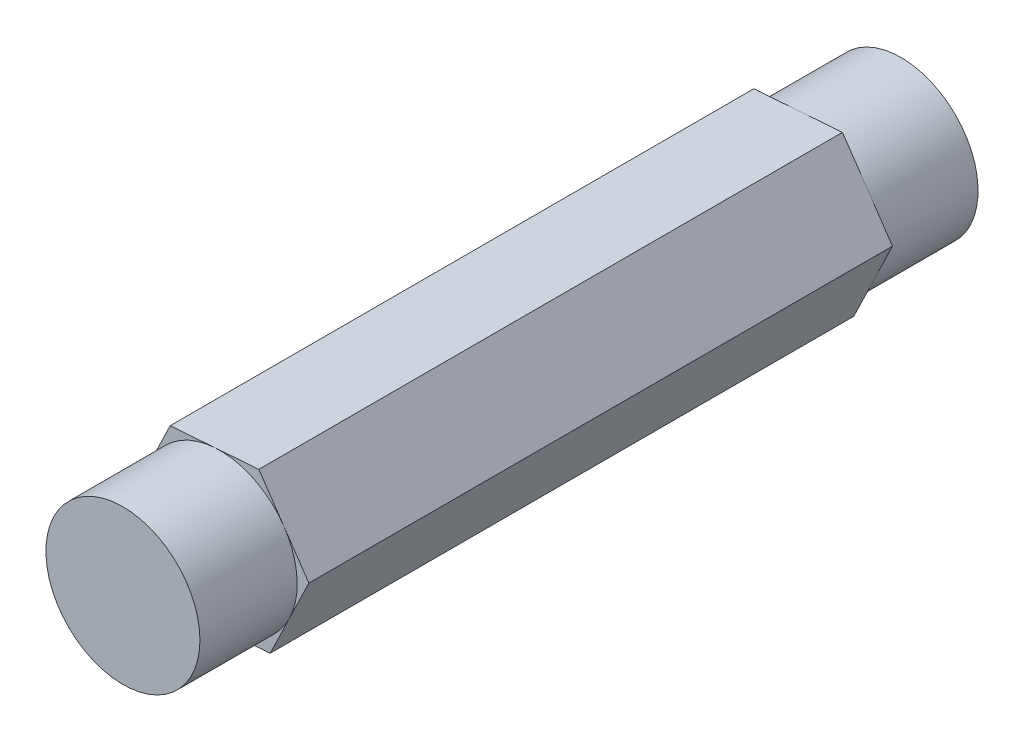
ISO-10303-21;
HEADER;
FILE_DESCRIPTION(('STEP AP214'),'2;1');
FILE_NAME('part.step','',(''),(''),'','','');
FILE_SCHEMA(('AUTOMOTIVE_DESIGN { 1 0 10303 214 1 1 1 1 }'));
ENDSEC;
DATA;
#1=APPLICATION_CONTEXT('core data for automotive mechanical design processes');
#2=APPLICATION_PROTOCOL_DEFINITION('international standard','automotive_design',2000,#1);
#3=PRODUCT_CONTEXT('',#1,'mechanical');
#4=PRODUCT('Part','Part','',(#3));
#5=PRODUCT_RELATED_PRODUCT_CATEGORY('part','',(#4));
#6=PRODUCT_DEFINITION_FORMATION('','',#4);
#7=PRODUCT_DEFINITION_CONTEXT('part definition',#1,'design');
#8=PRODUCT_DEFINITION('design','',#6,#7);
#9=PRODUCT_DEFINITION_SHAPE('','',#8);
#10=(LENGTH_UNIT() NAMED_UNIT(*) SI_UNIT(.MILLI.,.METRE.));
#11=(NAMED_UNIT(*) PLANE_ANGLE_UNIT() SI_UNIT($,.RADIAN.));
#12=(NAMED_UNIT(*) SI_UNIT($,.STERADIAN.) SOLID_ANGLE_UNIT());
#13=UNCERTAINTY_MEASURE_WITH_UNIT(LENGTH_MEASURE(1.E-05),#10,'distance_accuracy_value','');
#14=(GEOMETRIC_REPRESENTATION_CONTEXT(3) GLOBAL_UNCERTAINTY_ASSIGNED_CONTEXT((#13)) GLOBAL_UNIT_ASSIGNED_CONTEXT((#10,
#11,#12)) REPRESENTATION_CONTEXT('',''));
#15=CARTESIAN_POINT('',(0.,0.,0.));
#16=DIRECTION('',(0.,0.,1.));
#17=DIRECTION('',(1.,0.,0.));
#18=AXIS2_PLACEMENT_3D('',#15,#16,#17);
#19=CARTESIAN_POINT('',(0.,0.,36.));
#20=DIRECTION('',(0.,0.,1.));
#21=DIRECTION('',(1.,0.,0.));
#22=AXIS2_PLACEMENT_3D('',#19,#20,#21);
#23=PLANE('',#22);
#24=CARTESIAN_POINT('',(0.,0.,36.));
#25=DIRECTION('',(0.,0.,1.));
#26=DIRECTION('',(1.,0.,0.));
#27=AXIS2_PLACEMENT_3D('',#24,#25,#26);
#28=CIRCLE('',#27,4.75);
#29=CARTESIAN_POINT('',(3.92687464380982,2.67248115649176,36.));
#30=VERTEX_POINT('',#29);
#31=CARTESIAN_POINT('',(-0.35099925075217,4.73701377726215,36.));
#32=VERTEX_POINT('',#31);
#33=EDGE_CURVE('E45',#30,#32,#28,.T.);
#34=ORIENTED_EDGE('',*,*,#33,.F.);
#35=DIRECTION('',(-0.562627611893002,0.826710451328382,0.));
#36=VECTOR('',#35,1.);
#37=CARTESIAN_POINT('',(5.46983235891454,0.405299023814245,36.));
#38=LINE('',#37,#36);
#39=CARTESIAN_POINT('',(2.3839169287051,4.93966328916928,36.));
#40=VERTEX_POINT('',#39);
#41=EDGE_CURVE('E138',#30,#40,#38,.T.);
#42=ORIENTED_EDGE('',*,*,#41,.T.);
#43=DIRECTION('',(-0.997266058370979,-0.0738945791057199,0.));
#44=VECTOR('',#43,1.);
#45=CARTESIAN_POINT('',(2.3839169287051,4.93966328916928,36.));
#46=LINE('',#45,#44);
#47=EDGE_CURVE('E151',#40,#32,#46,.T.);
#48=ORIENTED_EDGE('',*,*,#47,.T.);
#49=EDGE_LOOP('',(#34,#42,#48));
#50=FACE_BOUND('',#49,.T.);
#51=ADVANCED_FACE('F34',(#50),#23,.T.);
#52=CARTESIAN_POINT('',(-4.27787389456199,2.06453262077039,36.));
#53=VERTEX_POINT('',#52);
#54=EDGE_CURVE('E11',#32,#53,#28,.T.);
#55=ORIENTED_EDGE('',*,*,#54,.F.);
#56=CARTESIAN_POINT('',(-3.08591543020944,4.53436426535503,36.));
#57=VERTEX_POINT('',#56);
#58=EDGE_CURVE('E137',#32,#57,#46,.T.);
#59=ORIENTED_EDGE('',*,*,#58,.T.);
#60=DIRECTION('',(-0.434638446477977,-0.900605030434103,0.));
#61=VECTOR('',#60,1.);
#62=CARTESIAN_POINT('',(-3.08591543020944,4.53436426535503,36.));
#63=LINE('',#62,#61);
#64=EDGE_CURVE('E171',#57,#53,#63,.T.);
#65=ORIENTED_EDGE('',*,*,#64,.T.);
#66=EDGE_LOOP('',(#55,#59,#65));
#67=FACE_BOUND('',#66,.T.);
#68=ADVANCED_FACE('F253',(#67),#23,.T.);
#69=CARTESIAN_POINT('',(-3.92687464380982,-2.67248115649176,36.));
#70=VERTEX_POINT('',#69);
#71=EDGE_CURVE('E43',#53,#70,#28,.T.);
#72=ORIENTED_EDGE('',*,*,#71,.F.);
#73=CARTESIAN_POINT('',(-5.46983235891454,-0.405299023814246,36.));
#74=VERTEX_POINT('',#73);
#75=EDGE_CURVE('E170',#53,#74,#63,.T.);
#76=ORIENTED_EDGE('',*,*,#75,.T.);
#77=DIRECTION('',(0.562627611893002,-0.826710451328382,0.));
#78=VECTOR('',#77,1.);
#79=CARTESIAN_POINT('',(-5.46983235891454,-0.405299023814246,36.));
#80=LINE('',#79,#78);
#81=EDGE_CURVE('E175',#74,#70,#80,.T.);
#82=ORIENTED_EDGE('',*,*,#81,.T.);
#83=EDGE_LOOP('',(#72,#76,#82));
#84=FACE_BOUND('',#83,.T.);
#85=ADVANCED_FACE('F256',(#84),#23,.T.);
#86=CARTESIAN_POINT('',(0.350999250752171,-4.73701377726215,36.));
#87=VERTEX_POINT('',#86);
#88=EDGE_CURVE('E60',#70,#87,#28,.T.);
#89=ORIENTED_EDGE('',*,*,#88,.F.);
#90=CARTESIAN_POINT('',(-2.3839169287051,-4.93966328916928,36.));
#91=VERTEX_POINT('',#90);
#92=EDGE_CURVE('E174',#70,#91,#80,.T.);
#93=ORIENTED_EDGE('',*,*,#92,.T.);
#94=DIRECTION('',(0.997266058370979,0.0738945791057201,0.));
#95=VECTOR('',#94,1.);
#96=CARTESIAN_POINT('',(-2.3839169287051,-4.93966328916928,36.));
#97=LINE('',#96,#95);
#98=EDGE_CURVE('E179',#91,#87,#97,.T.);
#99=ORIENTED_EDGE('',*,*,#98,.T.);
#100=EDGE_LOOP('',(#89,#93,#99));
#101=FACE_BOUND('',#100,.T.);
#102=ADVANCED_FACE('F258',(#101),#23,.T.);
#103=CARTESIAN_POINT('',(4.27787389456199,-2.06453262077039,36.));
#104=VERTEX_POINT('',#103);
#105=EDGE_CURVE('E52',#87,#104,#28,.T.);
#106=ORIENTED_EDGE('',*,*,#105,.F.);
#107=CARTESIAN_POINT('',(3.08591543020944,-4.53436426535503,36.));
#108=VERTEX_POINT('',#107);
#109=EDGE_CURVE('E178',#87,#108,#97,.T.);
#110=ORIENTED_EDGE('',*,*,#109,.T.);
#111=DIRECTION('',(0.434638446477977,0.900605030434103,0.));
#112=VECTOR('',#111,1.);
#113=CARTESIAN_POINT('',(3.08591543020944,-4.53436426535503,36.));
#114=LINE('',#113,#112);
#115=EDGE_CURVE('E149',#108,#104,#114,.T.);
#116=ORIENTED_EDGE('',*,*,#115,.T.);
#117=EDGE_LOOP('',(#106,#110,#116));
#118=FACE_BOUND('',#117,.T.);
#119=ADVANCED_FACE('F264',(#118),#23,.T.);
#120=CARTESIAN_POINT('',(0.,0.,0.));
#121=DIRECTION('',(0.,0.,1.));
#122=DIRECTION('',(1.,0.,0.));
#123=AXIS2_PLACEMENT_3D('',#120,#121,#122);
#124=PLANE('',#123);
#125=CARTESIAN_POINT('',(0.,0.,0.));
#126=DIRECTION('',(0.,0.,-1.));
#127=DIRECTION('',(-1.,0.,0.));
#128=AXIS2_PLACEMENT_3D('',#125,#126,#127);
#129=CIRCLE('',#128,4.75000000000001);
#130=CARTESIAN_POINT('',(-4.27787389456199,2.06453262077039,0.));
#131=VERTEX_POINT('',#130);
#132=CARTESIAN_POINT('',(-0.35099925075217,4.73701377726215,0.));
#133=VERTEX_POINT('',#132);
#134=EDGE_CURVE('E159',#131,#133,#129,.T.);
#135=ORIENTED_EDGE('',*,*,#134,.F.);
#136=DIRECTION('',(-0.434638446477977,-0.900605030434103,0.));
#137=VECTOR('',#136,1.);
#138=CARTESIAN_POINT('',(-3.08591543020944,4.53436426535503,0.));
#139=LINE('',#138,#137);
#140=CARTESIAN_POINT('',(-3.08591543020944,4.53436426535503,0.));
#141=VERTEX_POINT('',#140);
#142=EDGE_CURVE('E193',#141,#131,#139,.T.);
#143=ORIENTED_EDGE('',*,*,#142,.F.);
#144=DIRECTION('',(-0.997266058370979,-0.0738945791057199,0.));
#145=VECTOR('',#144,1.);
#146=CARTESIAN_POINT('',(2.3839169287051,4.93966328916928,0.));
#147=LINE('',#146,#145);
#148=EDGE_CURVE('E188',#133,#141,#147,.T.);
#149=ORIENTED_EDGE('',*,*,#148,.F.);
#150=EDGE_LOOP('',(#135,#143,#149));
#151=FACE_BOUND('',#150,.T.);
#152=ADVANCED_FACE('F236',(#151),#124,.F.);
#153=CARTESIAN_POINT('',(3.92687464380982,2.67248115649176,0.));
#154=VERTEX_POINT('',#153);
#155=EDGE_CURVE('E155',#133,#154,#129,.T.);
#156=ORIENTED_EDGE('',*,*,#155,.F.);
#157=CARTESIAN_POINT('',(2.3839169287051,4.93966328916928,0.));
#158=VERTEX_POINT('',#157);
#159=EDGE_CURVE('E189',#158,#133,#147,.T.);
#160=ORIENTED_EDGE('',*,*,#159,.F.);
#161=DIRECTION('',(-0.562627611893002,0.826710451328382,0.));
#162=VECTOR('',#161,1.);
#163=CARTESIAN_POINT('',(5.46983235891454,0.405299023814245,0.));
#164=LINE('',#163,#162);
#165=EDGE_CURVE('E185',#154,#158,#164,.T.);
#166=ORIENTED_EDGE('',*,*,#165,.F.);
#167=EDGE_LOOP('',(#156,#160,#166));
#168=FACE_BOUND('',#167,.T.);
#169=ADVANCED_FACE('F229',(#168),#124,.F.);
#170=CARTESIAN_POINT('',(4.27787389456199,-2.06453262077039,0.));
#171=VERTEX_POINT('',#170);
#172=EDGE_CURVE('E157',#154,#171,#129,.T.);
#173=ORIENTED_EDGE('',*,*,#172,.F.);
#174=CARTESIAN_POINT('',(5.46983235891454,0.405299023814245,0.));
#175=VERTEX_POINT('',#174);
#176=EDGE_CURVE('E186',#175,#154,#164,.T.);
#177=ORIENTED_EDGE('',*,*,#176,.F.);
#178=DIRECTION('',(0.434638446477977,0.900605030434103,0.));
#179=VECTOR('',#178,1.);
#180=CARTESIAN_POINT('',(3.08591543020944,-4.53436426535503,0.));
#181=LINE('',#180,#179);
#182=EDGE_CURVE('E164',#171,#175,#181,.T.);
#183=ORIENTED_EDGE('',*,*,#182,.F.);
#184=EDGE_LOOP('',(#173,#177,#183));
#185=FACE_BOUND('',#184,.T.);
#186=ADVANCED_FACE('F227',(#185),#124,.F.);
#187=CARTESIAN_POINT('',(0.350999250752171,-4.73701377726215,0.));
#188=VERTEX_POINT('',#187);
#189=EDGE_CURVE('E219',#171,#188,#129,.T.);
#190=ORIENTED_EDGE('',*,*,#189,.F.);
#191=CARTESIAN_POINT('',(3.08591543020944,-4.53436426535503,0.));
#192=VERTEX_POINT('',#191);
#193=EDGE_CURVE('E182',#192,#171,#181,.T.);
#194=ORIENTED_EDGE('',*,*,#193,.F.);
#195=DIRECTION('',(0.997266058370979,0.0738945791057201,0.));
#196=VECTOR('',#195,1.);
#197=CARTESIAN_POINT('',(-2.3839169287051,-4.93966328916928,0.));
#198=LINE('',#197,#196);
#199=EDGE_CURVE('E199',#188,#192,#198,.T.);
#200=ORIENTED_EDGE('',*,*,#199,.F.);
#201=EDGE_LOOP('',(#190,#194,#200));
#202=FACE_BOUND('',#201,.T.);
#203=ADVANCED_FACE('F300',(#202),#124,.F.);
#204=CARTESIAN_POINT('',(-3.92687464380982,-2.67248115649176,0.));
#205=VERTEX_POINT('',#204);
#206=EDGE_CURVE('E216',#188,#205,#129,.T.);
#207=ORIENTED_EDGE('',*,*,#206,.F.);
#208=CARTESIAN_POINT('',(-2.3839169287051,-4.93966328916928,0.));
#209=VERTEX_POINT('',#208);
#210=EDGE_CURVE('E200',#209,#188,#198,.T.);
#211=ORIENTED_EDGE('',*,*,#210,.F.);
#212=DIRECTION('',(0.562627611893002,-0.826710451328382,0.));
#213=VECTOR('',#212,1.);
#214=CARTESIAN_POINT('',(-5.46983235891454,-0.405299023814246,0.));
#215=LINE('',#214,#213);
#216=EDGE_CURVE('E195',#205,#209,#215,.T.);
#217=ORIENTED_EDGE('',*,*,#216,.F.);
#218=EDGE_LOOP('',(#207,#211,#217));
#219=FACE_BOUND('',#218,.T.);
#220=ADVANCED_FACE('F276',(#219),#124,.F.);
#221=CARTESIAN_POINT('',(3.08591543020944,-4.53436426535503,36.));
#222=DIRECTION('',(-0.900605030434103,0.434638446477977,0.));
#223=DIRECTION('',(-0.434638446477977,-0.900605030434103,0.));
#224=AXIS2_PLACEMENT_3D('',#221,#222,#223);
#225=PLANE('',#224);
#226=ORIENTED_EDGE('',*,*,#193,.T.);
#227=ORIENTED_EDGE('',*,*,#182,.T.);
#228=DIRECTION('',(0.,0.,-1.));
#229=VECTOR('',#228,1.);
#230=CARTESIAN_POINT('',(5.46983235891454,0.405299023814245,36.));
#231=LINE('',#230,#229);
#232=CARTESIAN_POINT('',(5.46983235891454,0.405299023814245,36.));
#233=VERTEX_POINT('',#232);
#234=EDGE_CURVE('E38',#233,#175,#231,.T.);
#235=ORIENTED_EDGE('',*,*,#234,.F.);
#236=EDGE_CURVE('E133',#104,#233,#114,.T.);
#237=ORIENTED_EDGE('',*,*,#236,.F.);
#238=ORIENTED_EDGE('',*,*,#115,.F.);
#239=DIRECTION('',(0.,0.,-1.));
#240=VECTOR('',#239,1.);
#241=CARTESIAN_POINT('',(3.08591543020944,-4.53436426535503,36.));
#242=LINE('',#241,#240);
#243=EDGE_CURVE('E181',#108,#192,#242,.T.);
#244=ORIENTED_EDGE('',*,*,#243,.T.);
#245=EDGE_LOOP('',(#226,#227,#235,#237,#238,#244));
#246=FACE_BOUND('',#245,.T.);
#247=ADVANCED_FACE('F36',(#246),#225,.F.);
#248=CARTESIAN_POINT('',(5.46983235891454,0.405299023814245,36.));
#249=DIRECTION('',(-0.826710451328382,-0.562627611893002,0.));
#250=DIRECTION('',(0.562627611893002,-0.826710451328383,0.));
#251=AXIS2_PLACEMENT_3D('',#248,#249,#250);
#252=PLANE('',#251);
#253=ORIENTED_EDGE('',*,*,#176,.T.);
#254=ORIENTED_EDGE('',*,*,#165,.T.);
#255=DIRECTION('',(0.,0.,-1.));
#256=VECTOR('',#255,1.);
#257=CARTESIAN_POINT('',(2.3839169287051,4.93966328916928,36.));
#258=LINE('',#257,#256);
#259=EDGE_CURVE('E145',#40,#158,#258,.T.);
#260=ORIENTED_EDGE('',*,*,#259,.F.);
#261=ORIENTED_EDGE('',*,*,#41,.F.);
#262=EDGE_CURVE('E127',#233,#30,#38,.T.);
#263=ORIENTED_EDGE('',*,*,#262,.F.);
#264=ORIENTED_EDGE('',*,*,#234,.T.);
#265=EDGE_LOOP('',(#253,#254,#260,#261,#263,#264));
#266=FACE_BOUND('',#265,.T.);
#267=ADVANCED_FACE('F143',(#266),#252,.F.);
#268=CARTESIAN_POINT('',(2.3839169287051,4.93966328916928,36.));
#269=DIRECTION('',(0.0738945791057199,-0.997266058370979,0.));
#270=DIRECTION('',(0.997266058370979,0.0738945791057199,0.));
#271=AXIS2_PLACEMENT_3D('',#268,#269,#270);
#272=PLANE('',#271);
#273=ORIENTED_EDGE('',*,*,#159,.T.);
#274=ORIENTED_EDGE('',*,*,#148,.T.);
#275=DIRECTION('',(0.,0.,-1.));
#276=VECTOR('',#275,1.);
#277=CARTESIAN_POINT('',(-3.08591543020944,4.53436426535503,36.));
#278=LINE('',#277,#276);
#279=EDGE_CURVE('E211',#57,#141,#278,.T.);
#280=ORIENTED_EDGE('',*,*,#279,.F.);
#281=ORIENTED_EDGE('',*,*,#58,.F.);
#282=ORIENTED_EDGE('',*,*,#47,.F.);
#283=ORIENTED_EDGE('',*,*,#259,.T.);
#284=EDGE_LOOP('',(#273,#274,#280,#281,#282,#283));
#285=FACE_BOUND('',#284,.T.);
#286=ADVANCED_FACE('F231',(#285),#272,.F.);
#287=CARTESIAN_POINT('',(-3.08591543020944,4.53436426535503,36.));
#288=DIRECTION('',(0.900605030434103,-0.434638446477977,0.));
#289=DIRECTION('',(0.434638446477977,0.900605030434103,0.));
#290=AXIS2_PLACEMENT_3D('',#287,#288,#289);
#291=PLANE('',#290);
#292=ORIENTED_EDGE('',*,*,#142,.T.);
#293=CARTESIAN_POINT('',(-5.46983235891454,-0.405299023814246,0.));
#294=VERTEX_POINT('',#293);
#295=EDGE_CURVE('E192',#131,#294,#139,.T.);
#296=ORIENTED_EDGE('',*,*,#295,.T.);
#297=DIRECTION('',(0.,0.,-1.));
#298=VECTOR('',#297,1.);
#299=CARTESIAN_POINT('',(-5.46983235891454,-0.405299023814246,36.));
#300=LINE('',#299,#298);
#301=EDGE_CURVE('E208',#74,#294,#300,.T.);
#302=ORIENTED_EDGE('',*,*,#301,.F.);
#303=ORIENTED_EDGE('',*,*,#75,.F.);
#304=ORIENTED_EDGE('',*,*,#64,.F.);
#305=ORIENTED_EDGE('',*,*,#279,.T.);
#306=EDGE_LOOP('',(#292,#296,#302,#303,#304,#305));
#307=FACE_BOUND('',#306,.T.);
#308=ADVANCED_FACE('F239',(#307),#291,.F.);
#309=CARTESIAN_POINT('',(-5.46983235891454,-0.405299023814246,36.));
#310=DIRECTION('',(0.826710451328382,0.562627611893002,0.));
#311=DIRECTION('',(-0.562627611893002,0.826710451328383,0.));
#312=AXIS2_PLACEMENT_3D('',#309,#310,#311);
#313=PLANE('',#312);
#314=EDGE_CURVE('E196',#294,#205,#215,.T.);
#315=ORIENTED_EDGE('',*,*,#314,.T.);
#316=ORIENTED_EDGE('',*,*,#216,.T.);
#317=DIRECTION('',(0.,0.,-1.));
#318=VECTOR('',#317,1.);
#319=CARTESIAN_POINT('',(-2.3839169287051,-4.93966328916928,36.));
#320=LINE('',#319,#318);
#321=EDGE_CURVE('E205',#91,#209,#320,.T.);
#322=ORIENTED_EDGE('',*,*,#321,.F.);
#323=ORIENTED_EDGE('',*,*,#92,.F.);
#324=ORIENTED_EDGE('',*,*,#81,.F.);
#325=ORIENTED_EDGE('',*,*,#301,.T.);
#326=EDGE_LOOP('',(#315,#316,#322,#323,#324,#325));
#327=FACE_BOUND('',#326,.T.);
#328=ADVANCED_FACE('F247',(#327),#313,.F.);
#329=CARTESIAN_POINT('',(-2.3839169287051,-4.93966328916928,36.));
#330=DIRECTION('',(-0.0738945791057201,0.997266058370979,0.));
#331=DIRECTION('',(-0.997266058370979,-0.0738945791057201,0.));
#332=AXIS2_PLACEMENT_3D('',#329,#330,#331);
#333=PLANE('',#332);
#334=ORIENTED_EDGE('',*,*,#210,.T.);
#335=ORIENTED_EDGE('',*,*,#199,.T.);
#336=ORIENTED_EDGE('',*,*,#243,.F.);
#337=ORIENTED_EDGE('',*,*,#109,.F.);
#338=ORIENTED_EDGE('',*,*,#98,.F.);
#339=ORIENTED_EDGE('',*,*,#321,.T.);
#340=EDGE_LOOP('',(#334,#335,#336,#337,#338,#339));
#341=FACE_BOUND('',#340,.T.);
#342=ADVANCED_FACE('F271',(#341),#333,.F.);
#343=EDGE_CURVE('E131',#104,#30,#28,.T.);
#344=ORIENTED_EDGE('',*,*,#343,.F.);
#345=ORIENTED_EDGE('',*,*,#236,.T.);
#346=ORIENTED_EDGE('',*,*,#262,.T.);
#347=EDGE_LOOP('',(#344,#345,#346));
#348=FACE_BOUND('',#347,.T.);
#349=ADVANCED_FACE('F129',(#348),#23,.T.);
#350=EDGE_CURVE('E167',#205,#131,#129,.T.);
#351=ORIENTED_EDGE('',*,*,#350,.F.);
#352=ORIENTED_EDGE('',*,*,#314,.F.);
#353=ORIENTED_EDGE('',*,*,#295,.F.);
#354=EDGE_LOOP('',(#351,#352,#353));
#355=FACE_BOUND('',#354,.T.);
#356=ADVANCED_FACE('F244',(#355),#124,.F.);
#357=CARTESIAN_POINT('',(0.,0.,-6.));
#358=DIRECTION('',(0.,0.,1.));
#359=DIRECTION('',(1.,0.,0.));
#360=AXIS2_PLACEMENT_3D('',#357,#358,#359);
#361=CYLINDRICAL_SURFACE('',#360,4.75000000000001);
#362=CARTESIAN_POINT('',(0.,0.,-6.));
#363=DIRECTION('',(0.,0.,-1.));
#364=DIRECTION('',(-1.,0.,0.));
#365=AXIS2_PLACEMENT_3D('',#362,#363,#364);
#366=CIRCLE('',#365,4.75000000000001);
#367=CARTESIAN_POINT('',(-4.75000000000001,0.,-6.));
#368=VERTEX_POINT('',#367);
#369=EDGE_CURVE('E162',#368,#368,#366,.T.);
#370=ORIENTED_EDGE('',*,*,#369,.F.);
#371=EDGE_LOOP('',(#370));
#372=FACE_BOUND('',#371,.T.);
#373=ORIENTED_EDGE('',*,*,#134,.T.);
#374=ORIENTED_EDGE('',*,*,#155,.T.);
#375=ORIENTED_EDGE('',*,*,#172,.T.);
#376=ORIENTED_EDGE('',*,*,#189,.T.);
#377=ORIENTED_EDGE('',*,*,#206,.T.);
#378=ORIENTED_EDGE('',*,*,#350,.T.);
#379=EDGE_LOOP('',(#373,#374,#375,#376,#377,#378));
#380=FACE_BOUND('',#379,.T.);
#381=ADVANCED_FACE('F222',(#372,#380),#361,.T.);
#382=CARTESIAN_POINT('',(0.,0.,-6.));
#383=DIRECTION('',(0.,0.,-1.));
#384=DIRECTION('',(-1.,0.,0.));
#385=AXIS2_PLACEMENT_3D('',#382,#383,#384);
#386=PLANE('',#385);
#387=ORIENTED_EDGE('',*,*,#369,.T.);
#388=EDGE_LOOP('',(#387));
#389=FACE_BOUND('',#388,.T.);
#390=ADVANCED_FACE('F333',(#389),#386,.T.);
#391=CARTESIAN_POINT('',(0.,0.,42.));
#392=DIRECTION('',(0.,0.,-1.));
#393=DIRECTION('',(-1.,0.,0.));
#394=AXIS2_PLACEMENT_3D('',#391,#392,#393);
#395=CYLINDRICAL_SURFACE('',#394,4.75);
#396=CARTESIAN_POINT('',(0.,0.,42.));
#397=DIRECTION('',(0.,0.,1.));
#398=DIRECTION('',(1.,0.,0.));
#399=AXIS2_PLACEMENT_3D('',#396,#397,#398);
#400=CIRCLE('',#399,4.75);
#401=CARTESIAN_POINT('',(4.75,0.,42.));
#402=VERTEX_POINT('',#401);
#403=EDGE_CURVE('E153',#402,#402,#400,.T.);
#404=ORIENTED_EDGE('',*,*,#403,.F.);
#405=EDGE_LOOP('',(#404));
#406=FACE_BOUND('',#405,.T.);
#407=ORIENTED_EDGE('',*,*,#33,.T.);
#408=ORIENTED_EDGE('',*,*,#54,.T.);
#409=ORIENTED_EDGE('',*,*,#71,.T.);
#410=ORIENTED_EDGE('',*,*,#88,.T.);
#411=ORIENTED_EDGE('',*,*,#105,.T.);
#412=ORIENTED_EDGE('',*,*,#343,.T.);
#413=EDGE_LOOP('',(#407,#408,#409,#410,#411,#412));
#414=FACE_BOUND('',#413,.T.);
#415=ADVANCED_FACE('F154',(#406,#414),#395,.T.);
#416=CARTESIAN_POINT('',(0.,0.,42.));
#417=DIRECTION('',(0.,0.,1.));
#418=DIRECTION('',(1.,0.,0.));
#419=AXIS2_PLACEMENT_3D('',#416,#417,#418);
#420=PLANE('',#419);
#421=ORIENTED_EDGE('',*,*,#403,.T.);
#422=EDGE_LOOP('',(#421));
#423=FACE_BOUND('',#422,.T.);
#424=ADVANCED_FACE('F372',(#423),#420,.T.);
#425=CLOSED_SHELL('',(#51,#68,#85,#102,#119,#152,#169,#186,#203,#220,#247,#267,#286,#308,#328,
#342,#349,#356,#381,#390,#415,#424));
#426=MANIFOLD_SOLID_BREP('B2',#425);
#427=ADVANCED_BREP_SHAPE_REPRESENTATION('',(#18,#426),#14);
#428=SHAPE_DEFINITION_REPRESENTATION(#9,#427);
ENDSEC;
END-ISO-10303-21;
